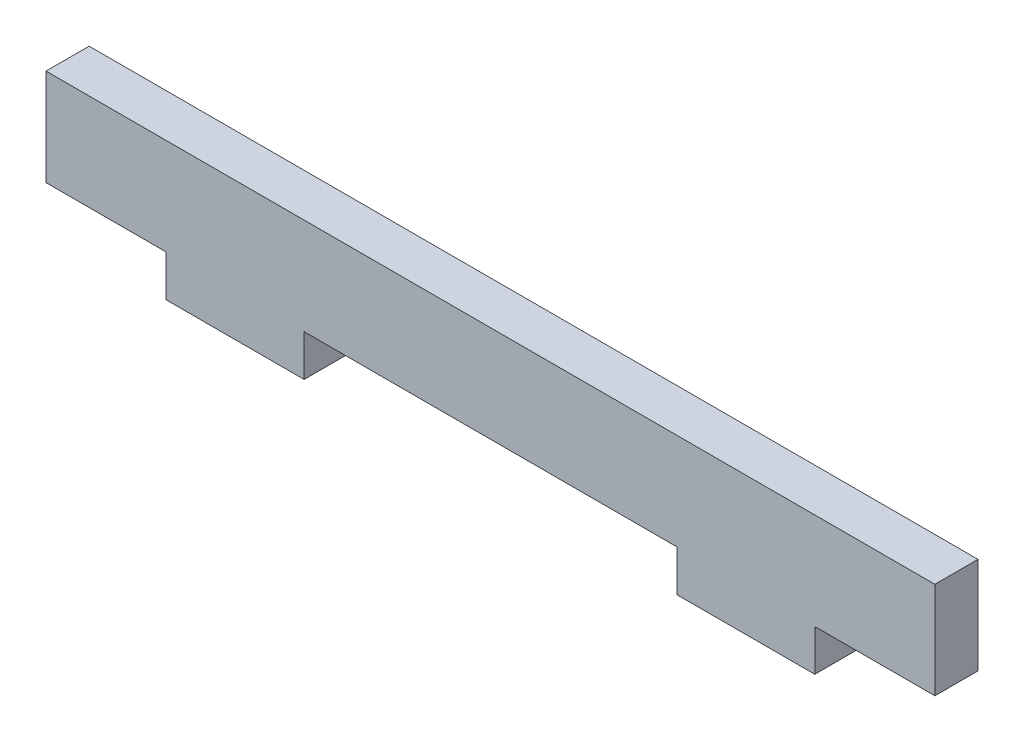
ISO-10303-21;
HEADER;
FILE_DESCRIPTION(('STEP AP214'),'2;1');
FILE_NAME('part.step','',(''),(''),'','','');
FILE_SCHEMA(('AUTOMOTIVE_DESIGN { 1 0 10303 214 1 1 1 1 }'));
ENDSEC;
DATA;
#1=APPLICATION_CONTEXT('core data for automotive mechanical design processes');
#2=APPLICATION_PROTOCOL_DEFINITION('international standard','automotive_design',2000,#1);
#3=PRODUCT_CONTEXT('',#1,'mechanical');
#4=PRODUCT('Part','Part','',(#3));
#5=PRODUCT_RELATED_PRODUCT_CATEGORY('part','',(#4));
#6=PRODUCT_DEFINITION_FORMATION('','',#4);
#7=PRODUCT_DEFINITION_CONTEXT('part definition',#1,'design');
#8=PRODUCT_DEFINITION('design','',#6,#7);
#9=PRODUCT_DEFINITION_SHAPE('','',#8);
#10=(LENGTH_UNIT() NAMED_UNIT(*) SI_UNIT(.MILLI.,.METRE.));
#11=(NAMED_UNIT(*) PLANE_ANGLE_UNIT() SI_UNIT($,.RADIAN.));
#12=(NAMED_UNIT(*) SI_UNIT($,.STERADIAN.) SOLID_ANGLE_UNIT());
#13=UNCERTAINTY_MEASURE_WITH_UNIT(LENGTH_MEASURE(1.E-05),#10,'distance_accuracy_value','');
#14=(GEOMETRIC_REPRESENTATION_CONTEXT(3) GLOBAL_UNCERTAINTY_ASSIGNED_CONTEXT((#13)) GLOBAL_UNIT_ASSIGNED_CONTEXT((#10,
#11,#12)) REPRESENTATION_CONTEXT('',''));
#15=CARTESIAN_POINT('',(0.,0.,0.));
#16=DIRECTION('',(0.,0.,1.));
#17=DIRECTION('',(1.,0.,0.));
#18=AXIS2_PLACEMENT_3D('',#15,#16,#17);
#19=CARTESIAN_POINT('',(37.5914893617021,9.71276595744682,3.125));
#20=DIRECTION('',(0.,-1.,0.));
#21=DIRECTION('',(1.,0.,0.));
#22=AXIS2_PLACEMENT_3D('',#19,#20,#21);
#23=PLANE('',#22);
#24=DIRECTION('',(-1.,0.,0.));
#25=VECTOR('',#24,1.);
#26=CARTESIAN_POINT('',(37.5914893617021,9.71276595744682,0.));
#27=LINE('',#26,#25);
#28=CARTESIAN_POINT('',(37.5914893617021,9.71276595744682,0.));
#29=VERTEX_POINT('',#28);
#30=CARTESIAN_POINT('',(-26.8085106382979,9.71276595744681,0.));
#31=VERTEX_POINT('',#30);
#32=EDGE_CURVE('E159',#29,#31,#27,.T.);
#33=ORIENTED_EDGE('',*,*,#32,.T.);
#34=DIRECTION('',(0.,0.,-1.));
#35=VECTOR('',#34,1.);
#36=CARTESIAN_POINT('',(-26.8085106382979,9.71276595744681,3.125));
#37=LINE('',#36,#35);
#38=CARTESIAN_POINT('',(-26.8085106382979,9.71276595744681,3.125));
#39=VERTEX_POINT('',#38);
#40=EDGE_CURVE('E11',#39,#31,#37,.T.);
#41=ORIENTED_EDGE('',*,*,#40,.F.);
#42=DIRECTION('',(-1.,0.,0.));
#43=VECTOR('',#42,1.);
#44=CARTESIAN_POINT('',(37.5914893617021,9.71276595744682,3.125));
#45=LINE('',#44,#43);
#46=CARTESIAN_POINT('',(37.5914893617021,9.71276595744682,3.125));
#47=VERTEX_POINT('',#46);
#48=EDGE_CURVE('E181',#47,#39,#45,.T.);
#49=ORIENTED_EDGE('',*,*,#48,.F.);
#50=DIRECTION('',(0.,0.,-1.));
#51=VECTOR('',#50,1.);
#52=CARTESIAN_POINT('',(37.5914893617021,9.71276595744682,3.125));
#53=LINE('',#52,#51);
#54=EDGE_CURVE('E155',#47,#29,#53,.T.);
#55=ORIENTED_EDGE('',*,*,#54,.T.);
#56=EDGE_LOOP('',(#33,#41,#49,#55));
#57=FACE_BOUND('',#56,.T.);
#58=ADVANCED_FACE('F39',(#57),#23,.F.);
#59=CARTESIAN_POINT('',(-26.8085106382979,9.71276595744681,3.125));
#60=DIRECTION('',(1.,0.,0.));
#61=DIRECTION('',(0.,0.,-1.));
#62=AXIS2_PLACEMENT_3D('',#59,#60,#61);
#63=PLANE('',#62);
#64=DIRECTION('',(0.,-1.,0.));
#65=VECTOR('',#64,1.);
#66=CARTESIAN_POINT('',(-26.8085106382979,9.71276595744681,0.));
#67=LINE('',#66,#65);
#68=CARTESIAN_POINT('',(-26.8085106382979,2.71276595744681,0.));
#69=VERTEX_POINT('',#68);
#70=EDGE_CURVE('E162',#31,#69,#67,.T.);
#71=ORIENTED_EDGE('',*,*,#70,.T.);
#72=DIRECTION('',(0.,0.,-1.));
#73=VECTOR('',#72,1.);
#74=CARTESIAN_POINT('',(-26.8085106382979,2.71276595744681,3.125));
#75=LINE('',#74,#73);
#76=CARTESIAN_POINT('',(-26.8085106382979,2.71276595744681,3.125));
#77=VERTEX_POINT('',#76);
#78=EDGE_CURVE('E47',#77,#69,#75,.T.);
#79=ORIENTED_EDGE('',*,*,#78,.F.);
#80=DIRECTION('',(0.,-1.,0.));
#81=VECTOR('',#80,1.);
#82=CARTESIAN_POINT('',(-26.8085106382979,9.71276595744681,3.125));
#83=LINE('',#82,#81);
#84=EDGE_CURVE('E110',#39,#77,#83,.T.);
#85=ORIENTED_EDGE('',*,*,#84,.F.);
#86=ORIENTED_EDGE('',*,*,#40,.T.);
#87=EDGE_LOOP('',(#71,#79,#85,#86));
#88=FACE_BOUND('',#87,.T.);
#89=ADVANCED_FACE('F259',(#88),#63,.F.);
#90=CARTESIAN_POINT('',(-26.8085106382979,2.71276595744681,3.125));
#91=DIRECTION('',(0.,1.,0.));
#92=DIRECTION('',(0.,0.,1.));
#93=AXIS2_PLACEMENT_3D('',#90,#91,#92);
#94=PLANE('',#93);
#95=DIRECTION('',(1.,0.,0.));
#96=VECTOR('',#95,1.);
#97=CARTESIAN_POINT('',(-26.8085106382979,2.71276595744681,0.));
#98=LINE('',#97,#96);
#99=CARTESIAN_POINT('',(-18.1085106382979,2.71276595744681,0.));
#100=VERTEX_POINT('',#99);
#101=EDGE_CURVE('E164',#69,#100,#98,.T.);
#102=ORIENTED_EDGE('',*,*,#101,.T.);
#103=DIRECTION('',(0.,0.,-1.));
#104=VECTOR('',#103,1.);
#105=CARTESIAN_POINT('',(-18.1085106382979,2.71276595744681,3.125));
#106=LINE('',#105,#104);
#107=CARTESIAN_POINT('',(-18.1085106382979,2.71276595744681,3.125));
#108=VERTEX_POINT('',#107);
#109=EDGE_CURVE('E200',#108,#100,#106,.T.);
#110=ORIENTED_EDGE('',*,*,#109,.F.);
#111=DIRECTION('',(1.,0.,0.));
#112=VECTOR('',#111,1.);
#113=CARTESIAN_POINT('',(-26.8085106382979,2.71276595744681,3.125));
#114=LINE('',#113,#112);
#115=EDGE_CURVE('E208',#77,#108,#114,.T.);
#116=ORIENTED_EDGE('',*,*,#115,.F.);
#117=ORIENTED_EDGE('',*,*,#78,.T.);
#118=EDGE_LOOP('',(#102,#110,#116,#117));
#119=FACE_BOUND('',#118,.T.);
#120=ADVANCED_FACE('F206',(#119),#94,.F.);
#121=CARTESIAN_POINT('',(-18.1085106382979,2.71276595744681,3.125));
#122=DIRECTION('',(1.,0.,0.));
#123=DIRECTION('',(0.,1.,0.));
#124=AXIS2_PLACEMENT_3D('',#121,#122,#123);
#125=PLANE('',#124);
#126=DIRECTION('',(0.,-1.,0.));
#127=VECTOR('',#126,1.);
#128=CARTESIAN_POINT('',(-18.1085106382979,2.71276595744681,0.));
#129=LINE('',#128,#127);
#130=CARTESIAN_POINT('',(-18.1085106382979,-0.287234042553188,0.));
#131=VERTEX_POINT('',#130);
#132=EDGE_CURVE('E166',#100,#131,#129,.T.);
#133=ORIENTED_EDGE('',*,*,#132,.T.);
#134=DIRECTION('',(0.,0.,-1.));
#135=VECTOR('',#134,1.);
#136=CARTESIAN_POINT('',(-18.1085106382979,-0.287234042553188,3.125));
#137=LINE('',#136,#135);
#138=CARTESIAN_POINT('',(-18.1085106382979,-0.287234042553188,3.125));
#139=VERTEX_POINT('',#138);
#140=EDGE_CURVE('E197',#139,#131,#137,.T.);
#141=ORIENTED_EDGE('',*,*,#140,.F.);
#142=DIRECTION('',(0.,-1.,0.));
#143=VECTOR('',#142,1.);
#144=CARTESIAN_POINT('',(-18.1085106382979,2.71276595744681,3.125));
#145=LINE('',#144,#143);
#146=EDGE_CURVE('E226',#108,#139,#145,.T.);
#147=ORIENTED_EDGE('',*,*,#146,.F.);
#148=ORIENTED_EDGE('',*,*,#109,.T.);
#149=EDGE_LOOP('',(#133,#141,#147,#148));
#150=FACE_BOUND('',#149,.T.);
#151=ADVANCED_FACE('F217',(#150),#125,.F.);
#152=CARTESIAN_POINT('',(-18.1085106382979,-0.287234042553188,3.125));
#153=DIRECTION('',(0.,1.,0.));
#154=DIRECTION('',(0.,0.,1.));
#155=AXIS2_PLACEMENT_3D('',#152,#153,#154);
#156=PLANE('',#155);
#157=DIRECTION('',(1.,0.,0.));
#158=VECTOR('',#157,1.);
#159=CARTESIAN_POINT('',(-18.1085106382979,-0.287234042553188,0.));
#160=LINE('',#159,#158);
#161=CARTESIAN_POINT('',(-8.1085106382979,-0.287234042553188,0.));
#162=VERTEX_POINT('',#161);
#163=EDGE_CURVE('E168',#131,#162,#160,.T.);
#164=ORIENTED_EDGE('',*,*,#163,.T.);
#165=DIRECTION('',(0.,0.,-1.));
#166=VECTOR('',#165,1.);
#167=CARTESIAN_POINT('',(-8.1085106382979,-0.287234042553188,3.125));
#168=LINE('',#167,#166);
#169=CARTESIAN_POINT('',(-8.1085106382979,-0.287234042553188,3.125));
#170=VERTEX_POINT('',#169);
#171=EDGE_CURVE('E194',#170,#162,#168,.T.);
#172=ORIENTED_EDGE('',*,*,#171,.F.);
#173=DIRECTION('',(1.,0.,0.));
#174=VECTOR('',#173,1.);
#175=CARTESIAN_POINT('',(-18.1085106382979,-0.287234042553188,3.125));
#176=LINE('',#175,#174);
#177=EDGE_CURVE('E223',#139,#170,#176,.T.);
#178=ORIENTED_EDGE('',*,*,#177,.F.);
#179=ORIENTED_EDGE('',*,*,#140,.T.);
#180=EDGE_LOOP('',(#164,#172,#178,#179));
#181=FACE_BOUND('',#180,.T.);
#182=ADVANCED_FACE('F221',(#181),#156,.F.);
#183=CARTESIAN_POINT('',(-8.1085106382979,-0.287234042553188,3.125));
#184=DIRECTION('',(-1.,0.,0.));
#185=DIRECTION('',(0.,0.,1.));
#186=AXIS2_PLACEMENT_3D('',#183,#184,#185);
#187=PLANE('',#186);
#188=DIRECTION('',(0.,1.,0.));
#189=VECTOR('',#188,1.);
#190=CARTESIAN_POINT('',(-8.1085106382979,-0.287234042553188,0.));
#191=LINE('',#190,#189);
#192=CARTESIAN_POINT('',(-8.1085106382979,2.71276595744681,0.));
#193=VERTEX_POINT('',#192);
#194=EDGE_CURVE('E170',#162,#193,#191,.T.);
#195=ORIENTED_EDGE('',*,*,#194,.T.);
#196=DIRECTION('',(0.,0.,-1.));
#197=VECTOR('',#196,1.);
#198=CARTESIAN_POINT('',(-8.1085106382979,2.71276595744681,3.125));
#199=LINE('',#198,#197);
#200=CARTESIAN_POINT('',(-8.1085106382979,2.71276595744681,3.125));
#201=VERTEX_POINT('',#200);
#202=EDGE_CURVE('E191',#201,#193,#199,.T.);
#203=ORIENTED_EDGE('',*,*,#202,.F.);
#204=DIRECTION('',(0.,1.,0.));
#205=VECTOR('',#204,1.);
#206=CARTESIAN_POINT('',(-8.1085106382979,-0.287234042553188,3.125));
#207=LINE('',#206,#205);
#208=EDGE_CURVE('E225',#170,#201,#207,.T.);
#209=ORIENTED_EDGE('',*,*,#208,.F.);
#210=ORIENTED_EDGE('',*,*,#171,.T.);
#211=EDGE_LOOP('',(#195,#203,#209,#210));
#212=FACE_BOUND('',#211,.T.);
#213=ADVANCED_FACE('F272',(#212),#187,.F.);
#214=CARTESIAN_POINT('',(-8.1085106382979,2.71276595744681,3.125));
#215=DIRECTION('',(0.,1.,0.));
#216=DIRECTION('',(0.,0.,1.));
#217=AXIS2_PLACEMENT_3D('',#214,#215,#216);
#218=PLANE('',#217);
#219=DIRECTION('',(1.,0.,0.));
#220=VECTOR('',#219,1.);
#221=CARTESIAN_POINT('',(-8.1085106382979,2.71276595744681,0.));
#222=LINE('',#221,#220);
#223=CARTESIAN_POINT('',(18.8914893617021,2.71276595744681,0.));
#224=VERTEX_POINT('',#223);
#225=EDGE_CURVE('E172',#193,#224,#222,.T.);
#226=ORIENTED_EDGE('',*,*,#225,.T.);
#227=DIRECTION('',(0.,0.,-1.));
#228=VECTOR('',#227,1.);
#229=CARTESIAN_POINT('',(18.8914893617021,2.71276595744681,3.125));
#230=LINE('',#229,#228);
#231=CARTESIAN_POINT('',(18.8914893617021,2.71276595744681,3.125));
#232=VERTEX_POINT('',#231);
#233=EDGE_CURVE('E188',#232,#224,#230,.T.);
#234=ORIENTED_EDGE('',*,*,#233,.F.);
#235=DIRECTION('',(1.,0.,0.));
#236=VECTOR('',#235,1.);
#237=CARTESIAN_POINT('',(-8.1085106382979,2.71276595744681,3.125));
#238=LINE('',#237,#236);
#239=EDGE_CURVE('E228',#201,#232,#238,.T.);
#240=ORIENTED_EDGE('',*,*,#239,.F.);
#241=ORIENTED_EDGE('',*,*,#202,.T.);
#242=EDGE_LOOP('',(#226,#234,#240,#241));
#243=FACE_BOUND('',#242,.T.);
#244=ADVANCED_FACE('F275',(#243),#218,.F.);
#245=CARTESIAN_POINT('',(18.8914893617021,2.71276595744681,3.125));
#246=DIRECTION('',(1.,0.,0.));
#247=DIRECTION('',(0.,0.,-1.));
#248=AXIS2_PLACEMENT_3D('',#245,#246,#247);
#249=PLANE('',#248);
#250=DIRECTION('',(0.,-1.,0.));
#251=VECTOR('',#250,1.);
#252=CARTESIAN_POINT('',(18.8914893617021,2.71276595744681,0.));
#253=LINE('',#252,#251);
#254=CARTESIAN_POINT('',(18.8914893617021,-0.287234042553188,0.));
#255=VERTEX_POINT('',#254);
#256=EDGE_CURVE('E174',#224,#255,#253,.T.);
#257=ORIENTED_EDGE('',*,*,#256,.T.);
#258=DIRECTION('',(0.,0.,-1.));
#259=VECTOR('',#258,1.);
#260=CARTESIAN_POINT('',(18.8914893617021,-0.287234042553188,3.125));
#261=LINE('',#260,#259);
#262=CARTESIAN_POINT('',(18.8914893617021,-0.287234042553188,3.125));
#263=VERTEX_POINT('',#262);
#264=EDGE_CURVE('E185',#263,#255,#261,.T.);
#265=ORIENTED_EDGE('',*,*,#264,.F.);
#266=DIRECTION('',(0.,-1.,0.));
#267=VECTOR('',#266,1.);
#268=CARTESIAN_POINT('',(18.8914893617021,2.71276595744681,3.125));
#269=LINE('',#268,#267);
#270=EDGE_CURVE('E234',#232,#263,#269,.T.);
#271=ORIENTED_EDGE('',*,*,#270,.F.);
#272=ORIENTED_EDGE('',*,*,#233,.T.);
#273=EDGE_LOOP('',(#257,#265,#271,#272));
#274=FACE_BOUND('',#273,.T.);
#275=ADVANCED_FACE('F240',(#274),#249,.F.);
#276=CARTESIAN_POINT('',(18.8914893617021,-0.287234042553188,3.125));
#277=DIRECTION('',(0.,1.,0.));
#278=DIRECTION('',(0.,0.,1.));
#279=AXIS2_PLACEMENT_3D('',#276,#277,#278);
#280=PLANE('',#279);
#281=DIRECTION('',(1.,0.,0.));
#282=VECTOR('',#281,1.);
#283=CARTESIAN_POINT('',(18.8914893617021,-0.287234042553188,0.));
#284=LINE('',#283,#282);
#285=CARTESIAN_POINT('',(28.8914893617021,-0.287234042553188,0.));
#286=VERTEX_POINT('',#285);
#287=EDGE_CURVE('E176',#255,#286,#284,.T.);
#288=ORIENTED_EDGE('',*,*,#287,.T.);
#289=DIRECTION('',(0.,0.,-1.));
#290=VECTOR('',#289,1.);
#291=CARTESIAN_POINT('',(28.8914893617021,-0.287234042553188,3.125));
#292=LINE('',#291,#290);
#293=CARTESIAN_POINT('',(28.8914893617021,-0.287234042553188,3.125));
#294=VERTEX_POINT('',#293);
#295=EDGE_CURVE('E150',#294,#286,#292,.T.);
#296=ORIENTED_EDGE('',*,*,#295,.F.);
#297=DIRECTION('',(1.,0.,0.));
#298=VECTOR('',#297,1.);
#299=CARTESIAN_POINT('',(18.8914893617021,-0.287234042553188,3.125));
#300=LINE('',#299,#298);
#301=EDGE_CURVE('E141',#263,#294,#300,.T.);
#302=ORIENTED_EDGE('',*,*,#301,.F.);
#303=ORIENTED_EDGE('',*,*,#264,.T.);
#304=EDGE_LOOP('',(#288,#296,#302,#303));
#305=FACE_BOUND('',#304,.T.);
#306=ADVANCED_FACE('F244',(#305),#280,.F.);
#307=CARTESIAN_POINT('',(28.8914893617021,-0.287234042553188,3.125));
#308=DIRECTION('',(-1.,0.,0.));
#309=DIRECTION('',(0.,0.,1.));
#310=AXIS2_PLACEMENT_3D('',#307,#308,#309);
#311=PLANE('',#310);
#312=DIRECTION('',(0.,1.,0.));
#313=VECTOR('',#312,1.);
#314=CARTESIAN_POINT('',(28.8914893617021,-0.287234042553188,0.));
#315=LINE('',#314,#313);
#316=CARTESIAN_POINT('',(28.8914893617021,2.71276595744681,0.));
#317=VERTEX_POINT('',#316);
#318=EDGE_CURVE('E149',#286,#317,#315,.T.);
#319=ORIENTED_EDGE('',*,*,#318,.T.);
#320=DIRECTION('',(0.,0.,-1.));
#321=VECTOR('',#320,1.);
#322=CARTESIAN_POINT('',(28.8914893617021,2.71276595744681,3.125));
#323=LINE('',#322,#321);
#324=CARTESIAN_POINT('',(28.8914893617021,2.71276595744681,3.125));
#325=VERTEX_POINT('',#324);
#326=EDGE_CURVE('E146',#325,#317,#323,.T.);
#327=ORIENTED_EDGE('',*,*,#326,.F.);
#328=DIRECTION('',(0.,1.,0.));
#329=VECTOR('',#328,1.);
#330=CARTESIAN_POINT('',(28.8914893617021,-0.287234042553188,3.125));
#331=LINE('',#330,#329);
#332=EDGE_CURVE('E135',#294,#325,#331,.T.);
#333=ORIENTED_EDGE('',*,*,#332,.F.);
#334=ORIENTED_EDGE('',*,*,#295,.T.);
#335=EDGE_LOOP('',(#319,#327,#333,#334));
#336=FACE_BOUND('',#335,.T.);
#337=ADVANCED_FACE('F147',(#336),#311,.F.);
#338=CARTESIAN_POINT('',(28.8914893617021,2.71276595744681,3.125));
#339=DIRECTION('',(0.,1.,0.));
#340=DIRECTION('',(0.,0.,1.));
#341=AXIS2_PLACEMENT_3D('',#338,#339,#340);
#342=PLANE('',#341);
#343=DIRECTION('',(1.,0.,0.));
#344=VECTOR('',#343,1.);
#345=CARTESIAN_POINT('',(28.8914893617021,2.71276595744681,0.));
#346=LINE('',#345,#344);
#347=CARTESIAN_POINT('',(37.5914893617021,2.71276595744681,0.));
#348=VERTEX_POINT('',#347);
#349=EDGE_CURVE('E96',#317,#348,#346,.T.);
#350=ORIENTED_EDGE('',*,*,#349,.T.);
#351=DIRECTION('',(0.,0.,-1.));
#352=VECTOR('',#351,1.);
#353=CARTESIAN_POINT('',(37.5914893617021,2.71276595744681,3.125));
#354=LINE('',#353,#352);
#355=CARTESIAN_POINT('',(37.5914893617021,2.71276595744681,3.125));
#356=VERTEX_POINT('',#355);
#357=EDGE_CURVE('E151',#356,#348,#354,.T.);
#358=ORIENTED_EDGE('',*,*,#357,.F.);
#359=DIRECTION('',(1.,0.,0.));
#360=VECTOR('',#359,1.);
#361=CARTESIAN_POINT('',(28.8914893617021,2.71276595744681,3.125));
#362=LINE('',#361,#360);
#363=EDGE_CURVE('E139',#325,#356,#362,.T.);
#364=ORIENTED_EDGE('',*,*,#363,.F.);
#365=ORIENTED_EDGE('',*,*,#326,.T.);
#366=EDGE_LOOP('',(#350,#358,#364,#365));
#367=FACE_BOUND('',#366,.T.);
#368=ADVANCED_FACE('F153',(#367),#342,.F.);
#369=CARTESIAN_POINT('',(37.5914893617021,2.71276595744681,3.125));
#370=DIRECTION('',(-1.,0.,0.));
#371=DIRECTION('',(0.,0.,1.));
#372=AXIS2_PLACEMENT_3D('',#369,#370,#371);
#373=PLANE('',#372);
#374=DIRECTION('',(0.,1.,0.));
#375=VECTOR('',#374,1.);
#376=CARTESIAN_POINT('',(37.5914893617021,2.71276595744681,0.));
#377=LINE('',#376,#375);
#378=EDGE_CURVE('E102',#348,#29,#377,.T.);
#379=ORIENTED_EDGE('',*,*,#378,.T.);
#380=ORIENTED_EDGE('',*,*,#54,.F.);
#381=DIRECTION('',(0.,1.,0.));
#382=VECTOR('',#381,1.);
#383=CARTESIAN_POINT('',(37.5914893617021,2.71276595744681,3.125));
#384=LINE('',#383,#382);
#385=EDGE_CURVE('E55',#356,#47,#384,.T.);
#386=ORIENTED_EDGE('',*,*,#385,.F.);
#387=ORIENTED_EDGE('',*,*,#357,.T.);
#388=EDGE_LOOP('',(#379,#380,#386,#387));
#389=FACE_BOUND('',#388,.T.);
#390=ADVANCED_FACE('F248',(#389),#373,.F.);
#391=CARTESIAN_POINT('',(0.,0.,3.125));
#392=DIRECTION('',(0.,0.,1.));
#393=DIRECTION('',(1.,0.,0.));
#394=AXIS2_PLACEMENT_3D('',#391,#392,#393);
#395=PLANE('',#394);
#396=ORIENTED_EDGE('',*,*,#48,.T.);
#397=ORIENTED_EDGE('',*,*,#84,.T.);
#398=ORIENTED_EDGE('',*,*,#115,.T.);
#399=ORIENTED_EDGE('',*,*,#146,.T.);
#400=ORIENTED_EDGE('',*,*,#177,.T.);
#401=ORIENTED_EDGE('',*,*,#208,.T.);
#402=ORIENTED_EDGE('',*,*,#239,.T.);
#403=ORIENTED_EDGE('',*,*,#270,.T.);
#404=ORIENTED_EDGE('',*,*,#301,.T.);
#405=ORIENTED_EDGE('',*,*,#332,.T.);
#406=ORIENTED_EDGE('',*,*,#363,.T.);
#407=ORIENTED_EDGE('',*,*,#385,.T.);
#408=EDGE_LOOP('',(#396,#397,#398,#399,#400,#401,#402,#403,#404,#405,#406,#407));
#409=FACE_BOUND('',#408,.T.);
#410=ADVANCED_FACE('F137',(#409),#395,.T.);
#411=CARTESIAN_POINT('',(0.,0.,0.));
#412=DIRECTION('',(0.,0.,1.));
#413=DIRECTION('',(1.,0.,0.));
#414=AXIS2_PLACEMENT_3D('',#411,#412,#413);
#415=PLANE('',#414);
#416=ORIENTED_EDGE('',*,*,#32,.F.);
#417=ORIENTED_EDGE('',*,*,#378,.F.);
#418=ORIENTED_EDGE('',*,*,#349,.F.);
#419=ORIENTED_EDGE('',*,*,#318,.F.);
#420=ORIENTED_EDGE('',*,*,#287,.F.);
#421=ORIENTED_EDGE('',*,*,#256,.F.);
#422=ORIENTED_EDGE('',*,*,#225,.F.);
#423=ORIENTED_EDGE('',*,*,#194,.F.);
#424=ORIENTED_EDGE('',*,*,#163,.F.);
#425=ORIENTED_EDGE('',*,*,#132,.F.);
#426=ORIENTED_EDGE('',*,*,#101,.F.);
#427=ORIENTED_EDGE('',*,*,#70,.F.);
#428=EDGE_LOOP('',(#416,#417,#418,#419,#420,#421,#422,#423,#424,#425,#426,#427));
#429=FACE_BOUND('',#428,.T.);
#430=ADVANCED_FACE('F212',(#429),#415,.F.);
#431=CLOSED_SHELL('',(#58,#89,#120,#151,#182,#213,#244,#275,#306,#337,#368,#390,#410,#430));
#432=MANIFOLD_SOLID_BREP('B2',#431);
#433=ADVANCED_BREP_SHAPE_REPRESENTATION('',(#18,#432),#14);
#434=SHAPE_DEFINITION_REPRESENTATION(#9,#433);
ENDSEC;
END-ISO-10303-21;
